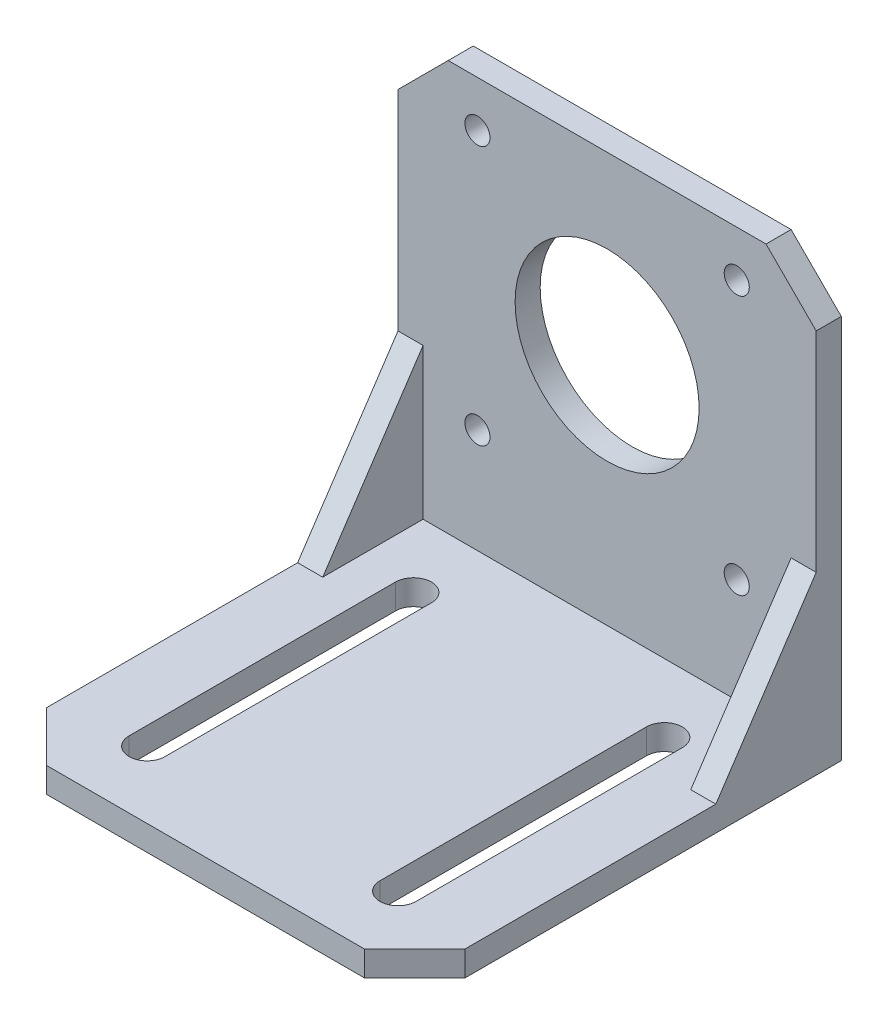
ISO-10303-21;
HEADER;
FILE_DESCRIPTION(('STEP AP214'),'2;1');
FILE_NAME('part.step','',(''),(''),'','','');
FILE_SCHEMA(('AUTOMOTIVE_DESIGN { 1 0 10303 214 1 1 1 1 }'));
ENDSEC;
DATA;
#1=APPLICATION_CONTEXT('core data for automotive mechanical design processes');
#2=APPLICATION_PROTOCOL_DEFINITION('international standard','automotive_design',2000,#1);
#3=PRODUCT_CONTEXT('',#1,'mechanical');
#4=PRODUCT('Part','Part','',(#3));
#5=PRODUCT_RELATED_PRODUCT_CATEGORY('part','',(#4));
#6=PRODUCT_DEFINITION_FORMATION('','',#4);
#7=PRODUCT_DEFINITION_CONTEXT('part definition',#1,'design');
#8=PRODUCT_DEFINITION('design','',#6,#7);
#9=PRODUCT_DEFINITION_SHAPE('','',#8);
#10=(LENGTH_UNIT() NAMED_UNIT(*) SI_UNIT(.MILLI.,.METRE.));
#11=(NAMED_UNIT(*) PLANE_ANGLE_UNIT() SI_UNIT($,.RADIAN.));
#12=(NAMED_UNIT(*) SI_UNIT($,.STERADIAN.) SOLID_ANGLE_UNIT());
#13=UNCERTAINTY_MEASURE_WITH_UNIT(LENGTH_MEASURE(1.E-05),#10,'distance_accuracy_value','');
#14=(GEOMETRIC_REPRESENTATION_CONTEXT(3) GLOBAL_UNCERTAINTY_ASSIGNED_CONTEXT((#13)) GLOBAL_UNIT_ASSIGNED_CONTEXT((#10,
#11,#12)) REPRESENTATION_CONTEXT('',''));
#15=CARTESIAN_POINT('',(0.,0.,0.));
#16=DIRECTION('',(0.,0.,1.));
#17=DIRECTION('',(1.,0.,0.));
#18=AXIS2_PLACEMENT_3D('',#15,#16,#17);
#19=CARTESIAN_POINT('',(0.,0.,3.));
#20=DIRECTION('',(0.,0.,1.));
#21=DIRECTION('',(1.,0.,0.));
#22=AXIS2_PLACEMENT_3D('',#19,#20,#21);
#23=PLANE('',#22);
#24=DIRECTION('',(-0.707106781186548,0.707106781186547,0.));
#25=VECTOR('',#24,1.);
#26=CARTESIAN_POINT('',(19.,21.,3.));
#27=LINE('',#26,#25);
#28=CARTESIAN_POINT('',(25.,15.,3.));
#29=VERTEX_POINT('',#28);
#30=CARTESIAN_POINT('',(19.,21.,3.));
#31=VERTEX_POINT('',#30);
#32=EDGE_CURVE('E254',#29,#31,#27,.T.);
#33=ORIENTED_EDGE('',*,*,#32,.T.);
#34=DIRECTION('',(-1.,0.,0.));
#35=VECTOR('',#34,1.);
#36=CARTESIAN_POINT('',(-25.,21.,3.));
#37=LINE('',#36,#35);
#38=CARTESIAN_POINT('',(-19.,21.,3.));
#39=VERTEX_POINT('',#38);
#40=EDGE_CURVE('E223',#31,#39,#37,.T.);
#41=ORIENTED_EDGE('',*,*,#40,.T.);
#42=DIRECTION('',(-0.707106781186548,-0.707106781186547,0.));
#43=VECTOR('',#42,1.);
#44=CARTESIAN_POINT('',(-19.,21.,3.));
#45=LINE('',#44,#43);
#46=CARTESIAN_POINT('',(-25.,15.,3.));
#47=VERTEX_POINT('',#46);
#48=EDGE_CURVE('E248',#39,#47,#45,.T.);
#49=ORIENTED_EDGE('',*,*,#48,.T.);
#50=DIRECTION('',(0.,-1.,0.));
#51=VECTOR('',#50,1.);
#52=CARTESIAN_POINT('',(-25.,21.,3.));
#53=LINE('',#52,#51);
#54=CARTESIAN_POINT('',(-25.,-9.99999999999997,2.99999999999999));
#55=VERTEX_POINT('',#54);
#56=EDGE_CURVE('E226',#47,#55,#53,.T.);
#57=ORIENTED_EDGE('',*,*,#56,.T.);
#58=DIRECTION('',(-1.,0.,0.));
#59=VECTOR('',#58,1.);
#60=CARTESIAN_POINT('',(-22.,-10.,3.));
#61=LINE('',#60,#59);
#62=CARTESIAN_POINT('',(-22.,-10.,3.));
#63=VERTEX_POINT('',#62);
#64=EDGE_CURVE('E271',#63,#55,#61,.T.);
#65=ORIENTED_EDGE('',*,*,#64,.F.);
#66=DIRECTION('',(0.,1.,0.));
#67=VECTOR('',#66,1.);
#68=CARTESIAN_POINT('',(-22.,-28.,3.));
#69=LINE('',#68,#67);
#70=CARTESIAN_POINT('',(-22.,-28.,3.));
#71=VERTEX_POINT('',#70);
#72=EDGE_CURVE('E259',#71,#63,#69,.T.);
#73=ORIENTED_EDGE('',*,*,#72,.F.);
#74=DIRECTION('',(-1.,0.,0.));
#75=VECTOR('',#74,1.);
#76=CARTESIAN_POINT('',(-25.,-28.,3.));
#77=LINE('',#76,#75);
#78=CARTESIAN_POINT('',(22.,-28.,3.));
#79=VERTEX_POINT('',#78);
#80=EDGE_CURVE('E321',#79,#71,#77,.T.);
#81=ORIENTED_EDGE('',*,*,#80,.F.);
#82=DIRECTION('',(0.,1.,0.));
#83=VECTOR('',#82,1.);
#84=CARTESIAN_POINT('',(22.,-28.,3.));
#85=LINE('',#84,#83);
#86=CARTESIAN_POINT('',(22.,-10.,3.));
#87=VERTEX_POINT('',#86);
#88=EDGE_CURVE('E280',#79,#87,#85,.T.);
#89=ORIENTED_EDGE('',*,*,#88,.T.);
#90=DIRECTION('',(-1.,0.,0.));
#91=VECTOR('',#90,1.);
#92=CARTESIAN_POINT('',(25.,-10.,3.));
#93=LINE('',#92,#91);
#94=CARTESIAN_POINT('',(25.,-10.,3.));
#95=VERTEX_POINT('',#94);
#96=EDGE_CURVE('E285',#95,#87,#93,.T.);
#97=ORIENTED_EDGE('',*,*,#96,.F.);
#98=DIRECTION('',(0.,1.,0.));
#99=VECTOR('',#98,1.);
#100=CARTESIAN_POINT('',(25.,-21.,3.));
#101=LINE('',#100,#99);
#102=EDGE_CURVE('E220',#95,#29,#101,.T.);
#103=ORIENTED_EDGE('',*,*,#102,.T.);
#104=EDGE_LOOP('',(#33,#41,#49,#57,#65,#73,#81,#89,#97,#103));
#105=FACE_BOUND('',#104,.T.);
#106=CARTESIAN_POINT('',(-15.5,-15.5,3.));
#107=DIRECTION('',(0.,0.,1.));
#108=DIRECTION('',(1.,0.,0.));
#109=AXIS2_PLACEMENT_3D('',#106,#107,#108);
#110=CIRCLE('',#109,1.5);
#111=CARTESIAN_POINT('',(-14.,-15.5,3.));
#112=VERTEX_POINT('',#111);
#113=EDGE_CURVE('E368',#112,#112,#110,.T.);
#114=ORIENTED_EDGE('',*,*,#113,.F.);
#115=EDGE_LOOP('',(#114));
#116=FACE_BOUND('',#115,.T.);
#117=CARTESIAN_POINT('',(-15.5,15.5,3.));
#118=DIRECTION('',(0.,0.,1.));
#119=DIRECTION('',(1.,0.,0.));
#120=AXIS2_PLACEMENT_3D('',#117,#118,#119);
#121=CIRCLE('',#120,1.5);
#122=CARTESIAN_POINT('',(-14.,15.5,3.));
#123=VERTEX_POINT('',#122);
#124=EDGE_CURVE('E380',#123,#123,#121,.T.);
#125=ORIENTED_EDGE('',*,*,#124,.F.);
#126=EDGE_LOOP('',(#125));
#127=FACE_BOUND('',#126,.T.);
#128=CARTESIAN_POINT('',(0.,0.,3.));
#129=DIRECTION('',(0.,0.,1.));
#130=DIRECTION('',(1.,0.,0.));
#131=AXIS2_PLACEMENT_3D('',#128,#129,#130);
#132=CIRCLE('',#131,11.);
#133=CARTESIAN_POINT('',(11.,0.,3.));
#134=VERTEX_POINT('',#133);
#135=EDGE_CURVE('E236',#134,#134,#132,.T.);
#136=ORIENTED_EDGE('',*,*,#135,.F.);
#137=EDGE_LOOP('',(#136));
#138=FACE_BOUND('',#137,.T.);
#139=CARTESIAN_POINT('',(15.5,15.5,3.));
#140=DIRECTION('',(0.,0.,1.));
#141=DIRECTION('',(1.,0.,0.));
#142=AXIS2_PLACEMENT_3D('',#139,#140,#141);
#143=CIRCLE('',#142,1.5);
#144=CARTESIAN_POINT('',(17.,15.5,3.));
#145=VERTEX_POINT('',#144);
#146=EDGE_CURVE('E374',#145,#145,#143,.T.);
#147=ORIENTED_EDGE('',*,*,#146,.F.);
#148=EDGE_LOOP('',(#147));
#149=FACE_BOUND('',#148,.T.);
#150=CARTESIAN_POINT('',(15.5,-15.5,3.));
#151=DIRECTION('',(0.,0.,1.));
#152=DIRECTION('',(1.,0.,0.));
#153=AXIS2_PLACEMENT_3D('',#150,#151,#152);
#154=CIRCLE('',#153,1.5);
#155=CARTESIAN_POINT('',(17.,-15.5,3.));
#156=VERTEX_POINT('',#155);
#157=EDGE_CURVE('E362',#156,#156,#154,.T.);
#158=ORIENTED_EDGE('',*,*,#157,.F.);
#159=EDGE_LOOP('',(#158));
#160=FACE_BOUND('',#159,.T.);
#161=ADVANCED_FACE('F36',(#105,#116,#127,#138,#149,#160),#23,.T.);
#162=CARTESIAN_POINT('',(-25.,-28.,51.));
#163=DIRECTION('',(0.,-1.,0.));
#164=DIRECTION('',(0.,0.,-1.));
#165=AXIS2_PLACEMENT_3D('',#162,#163,#164);
#166=PLANE('',#165);
#167=DIRECTION('',(0.,0.,-1.));
#168=VECTOR('',#167,1.);
#169=CARTESIAN_POINT('',(-12.85,-28.,43.));
#170=LINE('',#169,#168);
#171=CARTESIAN_POINT('',(-12.85,-28.,43.));
#172=VERTEX_POINT('',#171);
#173=CARTESIAN_POINT('',(-12.85,-28.,11.15));
#174=VERTEX_POINT('',#173);
#175=EDGE_CURVE('E291',#172,#174,#170,.T.);
#176=ORIENTED_EDGE('',*,*,#175,.F.);
#177=CARTESIAN_POINT('',(-15.,-28.,43.));
#178=DIRECTION('',(0.,-1.,0.));
#179=DIRECTION('',(0.,0.,-1.));
#180=AXIS2_PLACEMENT_3D('',#177,#178,#179);
#181=CIRCLE('',#180,2.15);
#182=CARTESIAN_POINT('',(-17.15,-28.,43.));
#183=VERTEX_POINT('',#182);
#184=EDGE_CURVE('E295',#183,#172,#181,.F.);
#185=ORIENTED_EDGE('',*,*,#184,.F.);
#186=DIRECTION('',(0.,0.,1.));
#187=VECTOR('',#186,1.);
#188=CARTESIAN_POINT('',(-17.15,-28.,43.));
#189=LINE('',#188,#187);
#190=CARTESIAN_POINT('',(-17.15,-28.,11.15));
#191=VERTEX_POINT('',#190);
#192=EDGE_CURVE('E312',#191,#183,#189,.T.);
#193=ORIENTED_EDGE('',*,*,#192,.F.);
#194=CARTESIAN_POINT('',(-15.,-28.,11.15));
#195=DIRECTION('',(0.,-1.,0.));
#196=DIRECTION('',(0.,0.,-1.));
#197=AXIS2_PLACEMENT_3D('',#194,#195,#196);
#198=CIRCLE('',#197,2.15);
#199=EDGE_CURVE('E289',#174,#191,#198,.F.);
#200=ORIENTED_EDGE('',*,*,#199,.F.);
#201=EDGE_LOOP('',(#176,#185,#193,#200));
#202=FACE_BOUND('',#201,.T.);
#203=DIRECTION('',(0.,0.,-1.));
#204=VECTOR('',#203,1.);
#205=CARTESIAN_POINT('',(17.15,-28.,43.));
#206=LINE('',#205,#204);
#207=CARTESIAN_POINT('',(17.15,-28.,43.));
#208=VERTEX_POINT('',#207);
#209=CARTESIAN_POINT('',(17.15,-28.,11.15));
#210=VERTEX_POINT('',#209);
#211=EDGE_CURVE('E323',#208,#210,#206,.T.);
#212=ORIENTED_EDGE('',*,*,#211,.F.);
#213=CARTESIAN_POINT('',(15.,-28.,43.));
#214=DIRECTION('',(0.,-1.,0.));
#215=DIRECTION('',(0.,0.,-1.));
#216=AXIS2_PLACEMENT_3D('',#213,#214,#215);
#217=CIRCLE('',#216,2.15);
#218=CARTESIAN_POINT('',(12.85,-28.,43.));
#219=VERTEX_POINT('',#218);
#220=EDGE_CURVE('E326',#219,#208,#217,.F.);
#221=ORIENTED_EDGE('',*,*,#220,.F.);
#222=DIRECTION('',(0.,0.,1.));
#223=VECTOR('',#222,1.);
#224=CARTESIAN_POINT('',(12.85,-28.,43.));
#225=LINE('',#224,#223);
#226=CARTESIAN_POINT('',(12.85,-28.,11.15));
#227=VERTEX_POINT('',#226);
#228=EDGE_CURVE('E292',#227,#219,#225,.T.);
#229=ORIENTED_EDGE('',*,*,#228,.F.);
#230=CARTESIAN_POINT('',(15.,-28.,11.15));
#231=DIRECTION('',(0.,-1.,0.));
#232=DIRECTION('',(0.,0.,-1.));
#233=AXIS2_PLACEMENT_3D('',#230,#231,#232);
#234=CIRCLE('',#233,2.15);
#235=EDGE_CURVE('E288',#210,#227,#234,.F.);
#236=ORIENTED_EDGE('',*,*,#235,.F.);
#237=EDGE_LOOP('',(#212,#221,#229,#236));
#238=FACE_BOUND('',#237,.T.);
#239=DIRECTION('',(0.,0.,-1.));
#240=VECTOR('',#239,1.);
#241=CARTESIAN_POINT('',(-25.,-28.,51.));
#242=LINE('',#241,#240);
#243=CARTESIAN_POINT('',(-25.,-28.,45.));
#244=VERTEX_POINT('',#243);
#245=CARTESIAN_POINT('',(-25.,-28.,15.));
#246=VERTEX_POINT('',#245);
#247=EDGE_CURVE('E355',#244,#246,#242,.T.);
#248=ORIENTED_EDGE('',*,*,#247,.F.);
#249=DIRECTION('',(-0.707106781186548,0.,-0.707106781186547));
#250=VECTOR('',#249,1.);
#251=CARTESIAN_POINT('',(-25.,-28.,45.));
#252=LINE('',#251,#250);
#253=CARTESIAN_POINT('',(-19.,-28.,51.));
#254=VERTEX_POINT('',#253);
#255=EDGE_CURVE('E185',#254,#244,#252,.T.);
#256=ORIENTED_EDGE('',*,*,#255,.F.);
#257=DIRECTION('',(-1.,0.,0.));
#258=VECTOR('',#257,1.);
#259=CARTESIAN_POINT('',(-25.,-28.,51.));
#260=LINE('',#259,#258);
#261=CARTESIAN_POINT('',(19.,-28.,51.));
#262=VERTEX_POINT('',#261);
#263=EDGE_CURVE('E352',#262,#254,#260,.T.);
#264=ORIENTED_EDGE('',*,*,#263,.F.);
#265=DIRECTION('',(-0.707106781186548,0.,0.707106781186547));
#266=VECTOR('',#265,1.);
#267=CARTESIAN_POINT('',(25.,-28.,45.));
#268=LINE('',#267,#266);
#269=CARTESIAN_POINT('',(25.,-28.,45.));
#270=VERTEX_POINT('',#269);
#271=EDGE_CURVE('E51',#270,#262,#268,.T.);
#272=ORIENTED_EDGE('',*,*,#271,.F.);
#273=DIRECTION('',(0.,0.,-1.));
#274=VECTOR('',#273,1.);
#275=CARTESIAN_POINT('',(25.,-28.,51.));
#276=LINE('',#275,#274);
#277=CARTESIAN_POINT('',(25.,-28.,15.));
#278=VERTEX_POINT('',#277);
#279=EDGE_CURVE('E359',#270,#278,#276,.T.);
#280=ORIENTED_EDGE('',*,*,#279,.T.);
#281=DIRECTION('',(-1.,0.,0.));
#282=VECTOR('',#281,1.);
#283=CARTESIAN_POINT('',(25.,-28.,15.));
#284=LINE('',#283,#282);
#285=CARTESIAN_POINT('',(22.,-28.,15.));
#286=VERTEX_POINT('',#285);
#287=EDGE_CURVE('E277',#278,#286,#284,.T.);
#288=ORIENTED_EDGE('',*,*,#287,.T.);
#289=DIRECTION('',(0.,0.,-1.));
#290=VECTOR('',#289,1.);
#291=CARTESIAN_POINT('',(22.,-28.,15.));
#292=LINE('',#291,#290);
#293=EDGE_CURVE('E273',#286,#79,#292,.T.);
#294=ORIENTED_EDGE('',*,*,#293,.T.);
#295=ORIENTED_EDGE('',*,*,#80,.T.);
#296=DIRECTION('',(0.,0.,-1.));
#297=VECTOR('',#296,1.);
#298=CARTESIAN_POINT('',(-22.,-28.,15.));
#299=LINE('',#298,#297);
#300=CARTESIAN_POINT('',(-22.,-28.,15.));
#301=VERTEX_POINT('',#300);
#302=EDGE_CURVE('E256',#301,#71,#299,.T.);
#303=ORIENTED_EDGE('',*,*,#302,.F.);
#304=DIRECTION('',(-1.,0.,0.));
#305=VECTOR('',#304,1.);
#306=CARTESIAN_POINT('',(-22.,-28.,15.));
#307=LINE('',#306,#305);
#308=EDGE_CURVE('E266',#301,#246,#307,.T.);
#309=ORIENTED_EDGE('',*,*,#308,.T.);
#310=EDGE_LOOP('',(#248,#256,#264,#272,#280,#288,#294,#295,#303,#309));
#311=FACE_BOUND('',#310,.T.);
#312=ADVANCED_FACE('F408',(#202,#238,#311),#166,.F.);
#313=CARTESIAN_POINT('',(0.,0.,0.));
#314=DIRECTION('',(0.,0.,1.));
#315=DIRECTION('',(1.,0.,0.));
#316=AXIS2_PLACEMENT_3D('',#313,#314,#315);
#317=PLANE('',#316);
#318=DIRECTION('',(-1.,0.,0.));
#319=VECTOR('',#318,1.);
#320=CARTESIAN_POINT('',(-25.,21.,0.));
#321=LINE('',#320,#319);
#322=CARTESIAN_POINT('',(19.,21.,0.));
#323=VERTEX_POINT('',#322);
#324=CARTESIAN_POINT('',(-19.,21.,0.));
#325=VERTEX_POINT('',#324);
#326=EDGE_CURVE('E210',#323,#325,#321,.T.);
#327=ORIENTED_EDGE('',*,*,#326,.F.);
#328=DIRECTION('',(-0.707106781186548,0.707106781186547,0.));
#329=VECTOR('',#328,1.);
#330=CARTESIAN_POINT('',(19.,21.,0.));
#331=LINE('',#330,#329);
#332=CARTESIAN_POINT('',(25.,15.,0.));
#333=VERTEX_POINT('',#332);
#334=EDGE_CURVE('E245',#333,#323,#331,.T.);
#335=ORIENTED_EDGE('',*,*,#334,.F.);
#336=DIRECTION('',(0.,1.,0.));
#337=VECTOR('',#336,1.);
#338=CARTESIAN_POINT('',(25.,21.,0.));
#339=LINE('',#338,#337);
#340=CARTESIAN_POINT('',(25.,-31.,0.));
#341=VERTEX_POINT('',#340);
#342=EDGE_CURVE('E218',#341,#333,#339,.T.);
#343=ORIENTED_EDGE('',*,*,#342,.F.);
#344=DIRECTION('',(1.,0.,0.));
#345=VECTOR('',#344,1.);
#346=CARTESIAN_POINT('',(-25.,-31.,0.));
#347=LINE('',#346,#345);
#348=CARTESIAN_POINT('',(-25.,-31.,0.));
#349=VERTEX_POINT('',#348);
#350=EDGE_CURVE('E209',#349,#341,#347,.T.);
#351=ORIENTED_EDGE('',*,*,#350,.F.);
#352=DIRECTION('',(0.,-1.,0.));
#353=VECTOR('',#352,1.);
#354=CARTESIAN_POINT('',(-25.,-21.,0.));
#355=LINE('',#354,#353);
#356=CARTESIAN_POINT('',(-25.,15.,0.));
#357=VERTEX_POINT('',#356);
#358=EDGE_CURVE('E203',#357,#349,#355,.T.);
#359=ORIENTED_EDGE('',*,*,#358,.F.);
#360=DIRECTION('',(-0.707106781186548,-0.707106781186547,0.));
#361=VECTOR('',#360,1.);
#362=CARTESIAN_POINT('',(-19.,21.,0.));
#363=LINE('',#362,#361);
#364=EDGE_CURVE('E246',#325,#357,#363,.T.);
#365=ORIENTED_EDGE('',*,*,#364,.F.);
#366=EDGE_LOOP('',(#327,#335,#343,#351,#359,#365));
#367=FACE_BOUND('',#366,.T.);
#368=CARTESIAN_POINT('',(0.,0.,0.));
#369=DIRECTION('',(0.,0.,1.));
#370=DIRECTION('',(1.,0.,0.));
#371=AXIS2_PLACEMENT_3D('',#368,#369,#370);
#372=CIRCLE('',#371,11.);
#373=CARTESIAN_POINT('',(11.,0.,0.));
#374=VERTEX_POINT('',#373);
#375=EDGE_CURVE('E383',#374,#374,#372,.T.);
#376=ORIENTED_EDGE('',*,*,#375,.T.);
#377=EDGE_LOOP('',(#376));
#378=FACE_BOUND('',#377,.T.);
#379=CARTESIAN_POINT('',(-15.5,15.5,0.));
#380=DIRECTION('',(0.,0.,1.));
#381=DIRECTION('',(1.,0.,0.));
#382=AXIS2_PLACEMENT_3D('',#379,#380,#381);
#383=CIRCLE('',#382,1.5);
#384=CARTESIAN_POINT('',(-14.,15.5,0.));
#385=VERTEX_POINT('',#384);
#386=EDGE_CURVE('E377',#385,#385,#383,.T.);
#387=ORIENTED_EDGE('',*,*,#386,.T.);
#388=EDGE_LOOP('',(#387));
#389=FACE_BOUND('',#388,.T.);
#390=CARTESIAN_POINT('',(15.5,15.5,0.));
#391=DIRECTION('',(0.,0.,1.));
#392=DIRECTION('',(1.,0.,0.));
#393=AXIS2_PLACEMENT_3D('',#390,#391,#392);
#394=CIRCLE('',#393,1.5);
#395=CARTESIAN_POINT('',(17.,15.5,0.));
#396=VERTEX_POINT('',#395);
#397=EDGE_CURVE('E371',#396,#396,#394,.T.);
#398=ORIENTED_EDGE('',*,*,#397,.T.);
#399=EDGE_LOOP('',(#398));
#400=FACE_BOUND('',#399,.T.);
#401=CARTESIAN_POINT('',(-15.5,-15.5,0.));
#402=DIRECTION('',(0.,0.,1.));
#403=DIRECTION('',(1.,0.,0.));
#404=AXIS2_PLACEMENT_3D('',#401,#402,#403);
#405=CIRCLE('',#404,1.5);
#406=CARTESIAN_POINT('',(-14.,-15.5,0.));
#407=VERTEX_POINT('',#406);
#408=EDGE_CURVE('E365',#407,#407,#405,.T.);
#409=ORIENTED_EDGE('',*,*,#408,.T.);
#410=EDGE_LOOP('',(#409));
#411=FACE_BOUND('',#410,.T.);
#412=CARTESIAN_POINT('',(15.5,-15.5,0.));
#413=DIRECTION('',(0.,0.,1.));
#414=DIRECTION('',(1.,0.,0.));
#415=AXIS2_PLACEMENT_3D('',#412,#413,#414);
#416=CIRCLE('',#415,1.5);
#417=CARTESIAN_POINT('',(17.,-15.5,0.));
#418=VERTEX_POINT('',#417);
#419=EDGE_CURVE('E361',#418,#418,#416,.T.);
#420=ORIENTED_EDGE('',*,*,#419,.T.);
#421=EDGE_LOOP('',(#420));
#422=FACE_BOUND('',#421,.T.);
#423=ADVANCED_FACE('F214',(#367,#378,#389,#400,#411,#422),#317,.F.);
#424=CARTESIAN_POINT('',(25.,21.,3.));
#425=DIRECTION('',(-1.,0.,0.));
#426=DIRECTION('',(0.,-1.,0.));
#427=AXIS2_PLACEMENT_3D('',#424,#425,#426);
#428=PLANE('',#427);
#429=ORIENTED_EDGE('',*,*,#279,.F.);
#430=DIRECTION('',(0.,-1.,0.));
#431=VECTOR('',#430,1.);
#432=CARTESIAN_POINT('',(25.,21.001,45.));
#433=LINE('',#432,#431);
#434=CARTESIAN_POINT('',(25.,-31.,45.));
#435=VERTEX_POINT('',#434);
#436=EDGE_CURVE('E427',#270,#435,#433,.T.);
#437=ORIENTED_EDGE('',*,*,#436,.T.);
#438=DIRECTION('',(0.,0.,-1.));
#439=VECTOR('',#438,1.);
#440=CARTESIAN_POINT('',(25.,-31.,3.));
#441=LINE('',#440,#439);
#442=EDGE_CURVE('E44',#435,#341,#441,.T.);
#443=ORIENTED_EDGE('',*,*,#442,.T.);
#444=ORIENTED_EDGE('',*,*,#342,.T.);
#445=DIRECTION('',(0.,0.,-1.));
#446=VECTOR('',#445,1.);
#447=CARTESIAN_POINT('',(25.,15.,51.001));
#448=LINE('',#447,#446);
#449=EDGE_CURVE('E443',#29,#333,#448,.T.);
#450=ORIENTED_EDGE('',*,*,#449,.F.);
#451=ORIENTED_EDGE('',*,*,#102,.F.);
#452=DIRECTION('',(0.,-0.832050294337844,0.554700196225229));
#453=VECTOR('',#452,1.);
#454=CARTESIAN_POINT('',(25.,-10.,3.));
#455=LINE('',#454,#453);
#456=EDGE_CURVE('E274',#95,#278,#455,.T.);
#457=ORIENTED_EDGE('',*,*,#456,.T.);
#458=EDGE_LOOP('',(#429,#437,#443,#444,#450,#451,#457));
#459=FACE_BOUND('',#458,.T.);
#460=ADVANCED_FACE('F38',(#459),#428,.F.);
#461=CARTESIAN_POINT('',(-25.,21.,3.));
#462=DIRECTION('',(0.,-1.,0.));
#463=DIRECTION('',(0.,0.,-1.));
#464=AXIS2_PLACEMENT_3D('',#461,#462,#463);
#465=PLANE('',#464);
#466=ORIENTED_EDGE('',*,*,#40,.F.);
#467=DIRECTION('',(0.,0.,-1.));
#468=VECTOR('',#467,1.);
#469=CARTESIAN_POINT('',(19.,21.,51.001));
#470=LINE('',#469,#468);
#471=EDGE_CURVE('E244',#31,#323,#470,.T.);
#472=ORIENTED_EDGE('',*,*,#471,.T.);
#473=ORIENTED_EDGE('',*,*,#326,.T.);
#474=DIRECTION('',(0.,0.,-1.));
#475=VECTOR('',#474,1.);
#476=CARTESIAN_POINT('',(-19.,21.,51.001));
#477=LINE('',#476,#475);
#478=EDGE_CURVE('E243',#39,#325,#477,.T.);
#479=ORIENTED_EDGE('',*,*,#478,.F.);
#480=EDGE_LOOP('',(#466,#472,#473,#479));
#481=FACE_BOUND('',#480,.T.);
#482=ADVANCED_FACE('F242',(#481),#465,.F.);
#483=CARTESIAN_POINT('',(-25.,-21.,3.));
#484=DIRECTION('',(1.,0.,0.));
#485=DIRECTION('',(0.,1.,0.));
#486=AXIS2_PLACEMENT_3D('',#483,#484,#485);
#487=PLANE('',#486);
#488=DIRECTION('',(0.,0.,-1.));
#489=VECTOR('',#488,1.);
#490=CARTESIAN_POINT('',(-25.,-31.,3.));
#491=LINE('',#490,#489);
#492=CARTESIAN_POINT('',(-25.,-31.,45.));
#493=VERTEX_POINT('',#492);
#494=EDGE_CURVE('E11',#493,#349,#491,.T.);
#495=ORIENTED_EDGE('',*,*,#494,.F.);
#496=DIRECTION('',(0.,-1.,0.));
#497=VECTOR('',#496,1.);
#498=CARTESIAN_POINT('',(-25.,21.001,45.));
#499=LINE('',#498,#497);
#500=EDGE_CURVE('E182',#244,#493,#499,.T.);
#501=ORIENTED_EDGE('',*,*,#500,.F.);
#502=ORIENTED_EDGE('',*,*,#247,.T.);
#503=DIRECTION('',(0.,-0.832050294337844,0.554700196225229));
#504=VECTOR('',#503,1.);
#505=CARTESIAN_POINT('',(-25.,-10.,3.));
#506=LINE('',#505,#504);
#507=EDGE_CURVE('E260',#55,#246,#506,.T.);
#508=ORIENTED_EDGE('',*,*,#507,.F.);
#509=ORIENTED_EDGE('',*,*,#56,.F.);
#510=DIRECTION('',(0.,0.,-1.));
#511=VECTOR('',#510,1.);
#512=CARTESIAN_POINT('',(-25.,15.,51.001));
#513=LINE('',#512,#511);
#514=EDGE_CURVE('E206',#47,#357,#513,.T.);
#515=ORIENTED_EDGE('',*,*,#514,.T.);
#516=ORIENTED_EDGE('',*,*,#358,.T.);
#517=EDGE_LOOP('',(#495,#501,#502,#508,#509,#515,#516));
#518=FACE_BOUND('',#517,.T.);
#519=ADVANCED_FACE('F200',(#518),#487,.F.);
#520=CARTESIAN_POINT('',(-25.,-31.,3.));
#521=DIRECTION('',(0.,1.,0.));
#522=DIRECTION('',(0.,0.,1.));
#523=AXIS2_PLACEMENT_3D('',#520,#521,#522);
#524=PLANE('',#523);
#525=DIRECTION('',(0.,0.,-1.));
#526=VECTOR('',#525,1.);
#527=CARTESIAN_POINT('',(-17.15,-31.,43.));
#528=LINE('',#527,#526);
#529=CARTESIAN_POINT('',(-17.15,-31.,43.));
#530=VERTEX_POINT('',#529);
#531=CARTESIAN_POINT('',(-17.15,-31.,11.15));
#532=VERTEX_POINT('',#531);
#533=EDGE_CURVE('E300',#530,#532,#528,.T.);
#534=ORIENTED_EDGE('',*,*,#533,.F.);
#535=CARTESIAN_POINT('',(-15.,-31.,43.));
#536=DIRECTION('',(0.,-1.,0.));
#537=DIRECTION('',(0.,0.,-1.));
#538=AXIS2_PLACEMENT_3D('',#535,#536,#537);
#539=CIRCLE('',#538,2.15);
#540=CARTESIAN_POINT('',(-12.85,-31.,43.));
#541=VERTEX_POINT('',#540);
#542=EDGE_CURVE('E298',#541,#530,#539,.T.);
#543=ORIENTED_EDGE('',*,*,#542,.F.);
#544=DIRECTION('',(0.,0.,1.));
#545=VECTOR('',#544,1.);
#546=CARTESIAN_POINT('',(-12.85,-31.,43.));
#547=LINE('',#546,#545);
#548=CARTESIAN_POINT('',(-12.85,-31.,11.15));
#549=VERTEX_POINT('',#548);
#550=EDGE_CURVE('E306',#549,#541,#547,.T.);
#551=ORIENTED_EDGE('',*,*,#550,.F.);
#552=CARTESIAN_POINT('',(-15.,-31.,11.15));
#553=DIRECTION('',(0.,-1.,0.));
#554=DIRECTION('',(0.,0.,-1.));
#555=AXIS2_PLACEMENT_3D('',#552,#553,#554);
#556=CIRCLE('',#555,2.15);
#557=EDGE_CURVE('E303',#532,#549,#556,.T.);
#558=ORIENTED_EDGE('',*,*,#557,.F.);
#559=EDGE_LOOP('',(#534,#543,#551,#558));
#560=FACE_BOUND('',#559,.T.);
#561=DIRECTION('',(0.,0.,-1.));
#562=VECTOR('',#561,1.);
#563=CARTESIAN_POINT('',(12.85,-31.,43.));
#564=LINE('',#563,#562);
#565=CARTESIAN_POINT('',(12.85,-31.,43.));
#566=VERTEX_POINT('',#565);
#567=CARTESIAN_POINT('',(12.85,-31.,11.15));
#568=VERTEX_POINT('',#567);
#569=EDGE_CURVE('E331',#566,#568,#564,.T.);
#570=ORIENTED_EDGE('',*,*,#569,.F.);
#571=CARTESIAN_POINT('',(15.,-31.,43.));
#572=DIRECTION('',(0.,-1.,0.));
#573=DIRECTION('',(0.,0.,1.));
#574=AXIS2_PLACEMENT_3D('',#571,#572,#573);
#575=CIRCLE('',#574,2.15);
#576=CARTESIAN_POINT('',(17.15,-31.,43.));
#577=VERTEX_POINT('',#576);
#578=EDGE_CURVE('E329',#577,#566,#575,.T.);
#579=ORIENTED_EDGE('',*,*,#578,.F.);
#580=DIRECTION('',(0.,0.,1.));
#581=VECTOR('',#580,1.);
#582=CARTESIAN_POINT('',(17.15,-31.,43.));
#583=LINE('',#582,#581);
#584=CARTESIAN_POINT('',(17.15,-31.,11.15));
#585=VERTEX_POINT('',#584);
#586=EDGE_CURVE('E337',#585,#577,#583,.T.);
#587=ORIENTED_EDGE('',*,*,#586,.F.);
#588=CARTESIAN_POINT('',(15.,-31.,11.15));
#589=DIRECTION('',(0.,-1.,0.));
#590=DIRECTION('',(0.,0.,1.));
#591=AXIS2_PLACEMENT_3D('',#588,#589,#590);
#592=CIRCLE('',#591,2.15);
#593=EDGE_CURVE('E334',#568,#585,#592,.T.);
#594=ORIENTED_EDGE('',*,*,#593,.F.);
#595=EDGE_LOOP('',(#570,#579,#587,#594));
#596=FACE_BOUND('',#595,.T.);
#597=DIRECTION('',(1.,0.,0.));
#598=VECTOR('',#597,1.);
#599=CARTESIAN_POINT('',(-25.,-31.,51.));
#600=LINE('',#599,#598);
#601=CARTESIAN_POINT('',(-19.,-31.,51.));
#602=VERTEX_POINT('',#601);
#603=CARTESIAN_POINT('',(19.,-31.,51.));
#604=VERTEX_POINT('',#603);
#605=EDGE_CURVE('E198',#602,#604,#600,.T.);
#606=ORIENTED_EDGE('',*,*,#605,.F.);
#607=DIRECTION('',(0.707106781186548,0.,0.707106781186547));
#608=VECTOR('',#607,1.);
#609=CARTESIAN_POINT('',(-25.,-31.,45.));
#610=LINE('',#609,#608);
#611=EDGE_CURVE('E59',#493,#602,#610,.T.);
#612=ORIENTED_EDGE('',*,*,#611,.F.);
#613=ORIENTED_EDGE('',*,*,#494,.T.);
#614=ORIENTED_EDGE('',*,*,#350,.T.);
#615=ORIENTED_EDGE('',*,*,#442,.F.);
#616=DIRECTION('',(0.707106781186548,0.,-0.707106781186547));
#617=VECTOR('',#616,1.);
#618=CARTESIAN_POINT('',(25.,-31.,45.));
#619=LINE('',#618,#617);
#620=EDGE_CURVE('E433',#604,#435,#619,.T.);
#621=ORIENTED_EDGE('',*,*,#620,.F.);
#622=EDGE_LOOP('',(#606,#612,#613,#614,#615,#621));
#623=FACE_BOUND('',#622,.T.);
#624=ADVANCED_FACE('F193',(#560,#596,#623),#524,.F.);
#625=CARTESIAN_POINT('',(0.,0.,3.));
#626=DIRECTION('',(0.,0.,-1.));
#627=DIRECTION('',(-1.,0.,0.));
#628=AXIS2_PLACEMENT_3D('',#625,#626,#627);
#629=CYLINDRICAL_SURFACE('',#628,11.);
#630=ORIENTED_EDGE('',*,*,#135,.T.);
#631=EDGE_LOOP('',(#630));
#632=FACE_BOUND('',#631,.T.);
#633=ORIENTED_EDGE('',*,*,#375,.F.);
#634=EDGE_LOOP('',(#633));
#635=FACE_BOUND('',#634,.T.);
#636=ADVANCED_FACE('F392',(#632,#635),#629,.F.);
#637=CARTESIAN_POINT('',(-15.5,15.5,3.));
#638=DIRECTION('',(0.,0.,-1.));
#639=DIRECTION('',(-1.,0.,0.));
#640=AXIS2_PLACEMENT_3D('',#637,#638,#639);
#641=CYLINDRICAL_SURFACE('',#640,1.5);
#642=ORIENTED_EDGE('',*,*,#124,.T.);
#643=EDGE_LOOP('',(#642));
#644=FACE_BOUND('',#643,.T.);
#645=ORIENTED_EDGE('',*,*,#386,.F.);
#646=EDGE_LOOP('',(#645));
#647=FACE_BOUND('',#646,.T.);
#648=ADVANCED_FACE('F394',(#644,#647),#641,.F.);
#649=CARTESIAN_POINT('',(15.5,15.5,3.));
#650=DIRECTION('',(0.,0.,-1.));
#651=DIRECTION('',(-1.,0.,0.));
#652=AXIS2_PLACEMENT_3D('',#649,#650,#651);
#653=CYLINDRICAL_SURFACE('',#652,1.5);
#654=ORIENTED_EDGE('',*,*,#146,.T.);
#655=EDGE_LOOP('',(#654));
#656=FACE_BOUND('',#655,.T.);
#657=ORIENTED_EDGE('',*,*,#397,.F.);
#658=EDGE_LOOP('',(#657));
#659=FACE_BOUND('',#658,.T.);
#660=ADVANCED_FACE('F401',(#656,#659),#653,.F.);
#661=CARTESIAN_POINT('',(-15.5,-15.5,3.));
#662=DIRECTION('',(0.,0.,-1.));
#663=DIRECTION('',(-1.,0.,0.));
#664=AXIS2_PLACEMENT_3D('',#661,#662,#663);
#665=CYLINDRICAL_SURFACE('',#664,1.5);
#666=ORIENTED_EDGE('',*,*,#113,.T.);
#667=EDGE_LOOP('',(#666));
#668=FACE_BOUND('',#667,.T.);
#669=ORIENTED_EDGE('',*,*,#408,.F.);
#670=EDGE_LOOP('',(#669));
#671=FACE_BOUND('',#670,.T.);
#672=ADVANCED_FACE('F523',(#668,#671),#665,.F.);
#673=CARTESIAN_POINT('',(15.5,-15.5,3.));
#674=DIRECTION('',(0.,0.,-1.));
#675=DIRECTION('',(-1.,0.,0.));
#676=AXIS2_PLACEMENT_3D('',#673,#674,#675);
#677=CYLINDRICAL_SURFACE('',#676,1.5);
#678=ORIENTED_EDGE('',*,*,#157,.T.);
#679=EDGE_LOOP('',(#678));
#680=FACE_BOUND('',#679,.T.);
#681=ORIENTED_EDGE('',*,*,#419,.F.);
#682=EDGE_LOOP('',(#681));
#683=FACE_BOUND('',#682,.T.);
#684=ADVANCED_FACE('F519',(#680,#683),#677,.F.);
#685=CARTESIAN_POINT('',(0.,0.,51.));
#686=DIRECTION('',(0.,0.,1.));
#687=DIRECTION('',(1.,0.,0.));
#688=AXIS2_PLACEMENT_3D('',#685,#686,#687);
#689=PLANE('',#688);
#690=DIRECTION('',(0.,-1.,0.));
#691=VECTOR('',#690,1.);
#692=CARTESIAN_POINT('',(-19.,21.001,51.));
#693=LINE('',#692,#691);
#694=EDGE_CURVE('E189',#254,#602,#693,.T.);
#695=ORIENTED_EDGE('',*,*,#694,.T.);
#696=ORIENTED_EDGE('',*,*,#605,.T.);
#697=DIRECTION('',(0.,-1.,0.));
#698=VECTOR('',#697,1.);
#699=CARTESIAN_POINT('',(19.,21.001,51.));
#700=LINE('',#699,#698);
#701=EDGE_CURVE('E435',#262,#604,#700,.T.);
#702=ORIENTED_EDGE('',*,*,#701,.F.);
#703=ORIENTED_EDGE('',*,*,#263,.T.);
#704=EDGE_LOOP('',(#695,#696,#702,#703));
#705=FACE_BOUND('',#704,.T.);
#706=ADVANCED_FACE('F464',(#705),#689,.T.);
#707=CARTESIAN_POINT('',(15.,21.001,43.));
#708=DIRECTION('',(0.,-1.,0.));
#709=DIRECTION('',(0.,0.,-1.));
#710=AXIS2_PLACEMENT_3D('',#707,#708,#709);
#711=CYLINDRICAL_SURFACE('',#710,2.15);
#712=ORIENTED_EDGE('',*,*,#220,.T.);
#713=DIRECTION('',(0.,-1.,0.));
#714=VECTOR('',#713,1.);
#715=CARTESIAN_POINT('',(17.15,21.001,43.));
#716=LINE('',#715,#714);
#717=EDGE_CURVE('E341',#208,#577,#716,.T.);
#718=ORIENTED_EDGE('',*,*,#717,.T.);
#719=ORIENTED_EDGE('',*,*,#578,.T.);
#720=DIRECTION('',(0.,-1.,0.));
#721=VECTOR('',#720,1.);
#722=CARTESIAN_POINT('',(12.85,21.001,43.));
#723=LINE('',#722,#721);
#724=EDGE_CURVE('E340',#219,#566,#723,.T.);
#725=ORIENTED_EDGE('',*,*,#724,.F.);
#726=EDGE_LOOP('',(#712,#718,#719,#725));
#727=FACE_BOUND('',#726,.T.);
#728=ADVANCED_FACE('F507',(#727),#711,.F.);
#729=CARTESIAN_POINT('',(17.15,21.001,43.));
#730=DIRECTION('',(1.,0.,0.));
#731=DIRECTION('',(0.,0.,-1.));
#732=AXIS2_PLACEMENT_3D('',#729,#730,#731);
#733=PLANE('',#732);
#734=ORIENTED_EDGE('',*,*,#211,.T.);
#735=DIRECTION('',(0.,-1.,0.));
#736=VECTOR('',#735,1.);
#737=CARTESIAN_POINT('',(17.15,21.001,11.15));
#738=LINE('',#737,#736);
#739=EDGE_CURVE('E343',#210,#585,#738,.T.);
#740=ORIENTED_EDGE('',*,*,#739,.T.);
#741=ORIENTED_EDGE('',*,*,#586,.T.);
#742=ORIENTED_EDGE('',*,*,#717,.F.);
#743=EDGE_LOOP('',(#734,#740,#741,#742));
#744=FACE_BOUND('',#743,.T.);
#745=ADVANCED_FACE('F503',(#744),#733,.F.);
#746=CARTESIAN_POINT('',(15.,21.001,11.15));
#747=DIRECTION('',(0.,-1.,0.));
#748=DIRECTION('',(0.,0.,-1.));
#749=AXIS2_PLACEMENT_3D('',#746,#747,#748);
#750=CYLINDRICAL_SURFACE('',#749,2.15);
#751=ORIENTED_EDGE('',*,*,#235,.T.);
#752=DIRECTION('',(0.,-1.,0.));
#753=VECTOR('',#752,1.);
#754=CARTESIAN_POINT('',(12.85,21.001,11.15));
#755=LINE('',#754,#753);
#756=EDGE_CURVE('E345',#227,#568,#755,.T.);
#757=ORIENTED_EDGE('',*,*,#756,.T.);
#758=ORIENTED_EDGE('',*,*,#593,.T.);
#759=ORIENTED_EDGE('',*,*,#739,.F.);
#760=EDGE_LOOP('',(#751,#757,#758,#759));
#761=FACE_BOUND('',#760,.T.);
#762=ADVANCED_FACE('F506',(#761),#750,.F.);
#763=CARTESIAN_POINT('',(12.85,21.001,43.));
#764=DIRECTION('',(-1.,0.,0.));
#765=DIRECTION('',(0.,0.,1.));
#766=AXIS2_PLACEMENT_3D('',#763,#764,#765);
#767=PLANE('',#766);
#768=ORIENTED_EDGE('',*,*,#228,.T.);
#769=ORIENTED_EDGE('',*,*,#724,.T.);
#770=ORIENTED_EDGE('',*,*,#569,.T.);
#771=ORIENTED_EDGE('',*,*,#756,.F.);
#772=EDGE_LOOP('',(#768,#769,#770,#771));
#773=FACE_BOUND('',#772,.T.);
#774=ADVANCED_FACE('F501',(#773),#767,.F.);
#775=CARTESIAN_POINT('',(-15.,21.001,43.));
#776=DIRECTION('',(0.,-1.,0.));
#777=DIRECTION('',(0.,0.,-1.));
#778=AXIS2_PLACEMENT_3D('',#775,#776,#777);
#779=CYLINDRICAL_SURFACE('',#778,2.15);
#780=ORIENTED_EDGE('',*,*,#184,.T.);
#781=DIRECTION('',(0.,-1.,0.));
#782=VECTOR('',#781,1.);
#783=CARTESIAN_POINT('',(-12.85,21.001,43.));
#784=LINE('',#783,#782);
#785=EDGE_CURVE('E310',#172,#541,#784,.T.);
#786=ORIENTED_EDGE('',*,*,#785,.T.);
#787=ORIENTED_EDGE('',*,*,#542,.T.);
#788=DIRECTION('',(0.,-1.,0.));
#789=VECTOR('',#788,1.);
#790=CARTESIAN_POINT('',(-17.15,21.001,43.));
#791=LINE('',#790,#789);
#792=EDGE_CURVE('E309',#183,#530,#791,.T.);
#793=ORIENTED_EDGE('',*,*,#792,.F.);
#794=EDGE_LOOP('',(#780,#786,#787,#793));
#795=FACE_BOUND('',#794,.T.);
#796=ADVANCED_FACE('F491',(#795),#779,.F.);
#797=CARTESIAN_POINT('',(-12.85,21.001,43.));
#798=DIRECTION('',(1.,0.,0.));
#799=DIRECTION('',(0.,0.,-1.));
#800=AXIS2_PLACEMENT_3D('',#797,#798,#799);
#801=PLANE('',#800);
#802=ORIENTED_EDGE('',*,*,#175,.T.);
#803=DIRECTION('',(0.,-1.,0.));
#804=VECTOR('',#803,1.);
#805=CARTESIAN_POINT('',(-12.85,21.001,11.15));
#806=LINE('',#805,#804);
#807=EDGE_CURVE('E313',#174,#549,#806,.T.);
#808=ORIENTED_EDGE('',*,*,#807,.T.);
#809=ORIENTED_EDGE('',*,*,#550,.T.);
#810=ORIENTED_EDGE('',*,*,#785,.F.);
#811=EDGE_LOOP('',(#802,#808,#809,#810));
#812=FACE_BOUND('',#811,.T.);
#813=ADVANCED_FACE('F487',(#812),#801,.F.);
#814=CARTESIAN_POINT('',(-15.,21.001,11.15));
#815=DIRECTION('',(0.,-1.,0.));
#816=DIRECTION('',(0.,0.,-1.));
#817=AXIS2_PLACEMENT_3D('',#814,#815,#816);
#818=CYLINDRICAL_SURFACE('',#817,2.15);
#819=ORIENTED_EDGE('',*,*,#199,.T.);
#820=DIRECTION('',(0.,-1.,0.));
#821=VECTOR('',#820,1.);
#822=CARTESIAN_POINT('',(-17.15,21.001,11.15));
#823=LINE('',#822,#821);
#824=EDGE_CURVE('E315',#191,#532,#823,.T.);
#825=ORIENTED_EDGE('',*,*,#824,.T.);
#826=ORIENTED_EDGE('',*,*,#557,.T.);
#827=ORIENTED_EDGE('',*,*,#807,.F.);
#828=EDGE_LOOP('',(#819,#825,#826,#827));
#829=FACE_BOUND('',#828,.T.);
#830=ADVANCED_FACE('F490',(#829),#818,.F.);
#831=CARTESIAN_POINT('',(-17.15,21.001,43.));
#832=DIRECTION('',(-1.,0.,0.));
#833=DIRECTION('',(0.,0.,1.));
#834=AXIS2_PLACEMENT_3D('',#831,#832,#833);
#835=PLANE('',#834);
#836=ORIENTED_EDGE('',*,*,#192,.T.);
#837=ORIENTED_EDGE('',*,*,#792,.T.);
#838=ORIENTED_EDGE('',*,*,#533,.T.);
#839=ORIENTED_EDGE('',*,*,#824,.F.);
#840=EDGE_LOOP('',(#836,#837,#838,#839));
#841=FACE_BOUND('',#840,.T.);
#842=ADVANCED_FACE('F486',(#841),#835,.F.);
#843=CARTESIAN_POINT('',(25.,-10.,3.));
#844=DIRECTION('',(0.,-0.554700196225229,-0.832050294337844));
#845=DIRECTION('',(0.,0.832050294337844,-0.554700196225229));
#846=AXIS2_PLACEMENT_3D('',#843,#844,#845);
#847=PLANE('',#846);
#848=DIRECTION('',(0.,-0.832050294337844,0.554700196225229));
#849=VECTOR('',#848,1.);
#850=CARTESIAN_POINT('',(22.,-10.,3.));
#851=LINE('',#850,#849);
#852=EDGE_CURVE('E278',#87,#286,#851,.T.);
#853=ORIENTED_EDGE('',*,*,#852,.T.);
#854=ORIENTED_EDGE('',*,*,#287,.F.);
#855=ORIENTED_EDGE('',*,*,#456,.F.);
#856=ORIENTED_EDGE('',*,*,#96,.T.);
#857=EDGE_LOOP('',(#853,#854,#855,#856));
#858=FACE_BOUND('',#857,.T.);
#859=ADVANCED_FACE('F451',(#858),#847,.F.);
#860=CARTESIAN_POINT('',(22.,0.,0.));
#861=DIRECTION('',(1.,0.,0.));
#862=DIRECTION('',(0.,0.,-1.));
#863=AXIS2_PLACEMENT_3D('',#860,#861,#862);
#864=PLANE('',#863);
#865=ORIENTED_EDGE('',*,*,#293,.F.);
#866=ORIENTED_EDGE('',*,*,#852,.F.);
#867=ORIENTED_EDGE('',*,*,#88,.F.);
#868=EDGE_LOOP('',(#865,#866,#867));
#869=FACE_BOUND('',#868,.T.);
#870=ADVANCED_FACE('F454',(#869),#864,.F.);
#871=CARTESIAN_POINT('',(-22.,-10.,3.));
#872=DIRECTION('',(0.,-0.554700196225229,-0.832050294337844));
#873=DIRECTION('',(0.,0.832050294337844,-0.554700196225229));
#874=AXIS2_PLACEMENT_3D('',#871,#872,#873);
#875=PLANE('',#874);
#876=ORIENTED_EDGE('',*,*,#507,.T.);
#877=ORIENTED_EDGE('',*,*,#308,.F.);
#878=DIRECTION('',(0.,-0.832050294337844,0.554700196225229));
#879=VECTOR('',#878,1.);
#880=CARTESIAN_POINT('',(-22.,-10.,3.));
#881=LINE('',#880,#879);
#882=EDGE_CURVE('E263',#63,#301,#881,.T.);
#883=ORIENTED_EDGE('',*,*,#882,.F.);
#884=ORIENTED_EDGE('',*,*,#64,.T.);
#885=EDGE_LOOP('',(#876,#877,#883,#884));
#886=FACE_BOUND('',#885,.T.);
#887=ADVANCED_FACE('F460',(#886),#875,.F.);
#888=CARTESIAN_POINT('',(-22.,0.,0.));
#889=DIRECTION('',(1.,0.,0.));
#890=DIRECTION('',(0.,0.,-1.));
#891=AXIS2_PLACEMENT_3D('',#888,#889,#890);
#892=PLANE('',#891);
#893=ORIENTED_EDGE('',*,*,#302,.T.);
#894=ORIENTED_EDGE('',*,*,#72,.T.);
#895=ORIENTED_EDGE('',*,*,#882,.T.);
#896=EDGE_LOOP('',(#893,#894,#895));
#897=FACE_BOUND('',#896,.T.);
#898=ADVANCED_FACE('F457',(#897),#892,.T.);
#899=CARTESIAN_POINT('',(-19.,21.,51.001));
#900=DIRECTION('',(0.707106781186547,-0.707106781186548,0.));
#901=DIRECTION('',(0.707106781186548,0.707106781186547,0.));
#902=AXIS2_PLACEMENT_3D('',#899,#900,#901);
#903=PLANE('',#902);
#904=ORIENTED_EDGE('',*,*,#478,.T.);
#905=ORIENTED_EDGE('',*,*,#364,.T.);
#906=ORIENTED_EDGE('',*,*,#514,.F.);
#907=ORIENTED_EDGE('',*,*,#48,.F.);
#908=EDGE_LOOP('',(#904,#905,#906,#907));
#909=FACE_BOUND('',#908,.T.);
#910=ADVANCED_FACE('F473',(#909),#903,.F.);
#911=CARTESIAN_POINT('',(19.,21.,51.001));
#912=DIRECTION('',(-0.707106781186547,-0.707106781186548,0.));
#913=DIRECTION('',(0.707106781186548,-0.707106781186547,0.));
#914=AXIS2_PLACEMENT_3D('',#911,#912,#913);
#915=PLANE('',#914);
#916=ORIENTED_EDGE('',*,*,#449,.T.);
#917=ORIENTED_EDGE('',*,*,#334,.T.);
#918=ORIENTED_EDGE('',*,*,#471,.F.);
#919=ORIENTED_EDGE('',*,*,#32,.F.);
#920=EDGE_LOOP('',(#916,#917,#918,#919));
#921=FACE_BOUND('',#920,.T.);
#922=ADVANCED_FACE('F446',(#921),#915,.F.);
#923=CARTESIAN_POINT('',(25.,21.001,45.));
#924=DIRECTION('',(-0.707106781186547,0.,-0.707106781186548));
#925=DIRECTION('',(-0.707106781186548,0.,0.707106781186547));
#926=AXIS2_PLACEMENT_3D('',#923,#924,#925);
#927=PLANE('',#926);
#928=ORIENTED_EDGE('',*,*,#271,.T.);
#929=ORIENTED_EDGE('',*,*,#701,.T.);
#930=ORIENTED_EDGE('',*,*,#620,.T.);
#931=ORIENTED_EDGE('',*,*,#436,.F.);
#932=EDGE_LOOP('',(#928,#929,#930,#931));
#933=FACE_BOUND('',#932,.T.);
#934=ADVANCED_FACE('F465',(#933),#927,.F.);
#935=CARTESIAN_POINT('',(-25.,21.001,45.));
#936=DIRECTION('',(0.707106781186547,0.,-0.707106781186548));
#937=DIRECTION('',(-0.707106781186548,0.,-0.707106781186547));
#938=AXIS2_PLACEMENT_3D('',#935,#936,#937);
#939=PLANE('',#938);
#940=ORIENTED_EDGE('',*,*,#255,.T.);
#941=ORIENTED_EDGE('',*,*,#500,.T.);
#942=ORIENTED_EDGE('',*,*,#611,.T.);
#943=ORIENTED_EDGE('',*,*,#694,.F.);
#944=EDGE_LOOP('',(#940,#941,#942,#943));
#945=FACE_BOUND('',#944,.T.);
#946=ADVANCED_FACE('F183',(#945),#939,.F.);
#947=CLOSED_SHELL('',(#161,#312,#423,#460,#482,#519,#624,#636,#648,#660,#672,#684,#706,#728,
#745,#762,#774,#796,#813,#830,#842,#859,#870,#887,#898,#910,#922,#934,#946));
#948=MANIFOLD_SOLID_BREP('B2',#947);
#949=ADVANCED_BREP_SHAPE_REPRESENTATION('',(#18,#948),#14);
#950=SHAPE_DEFINITION_REPRESENTATION(#9,#949);
ENDSEC;
END-ISO-10303-21;
